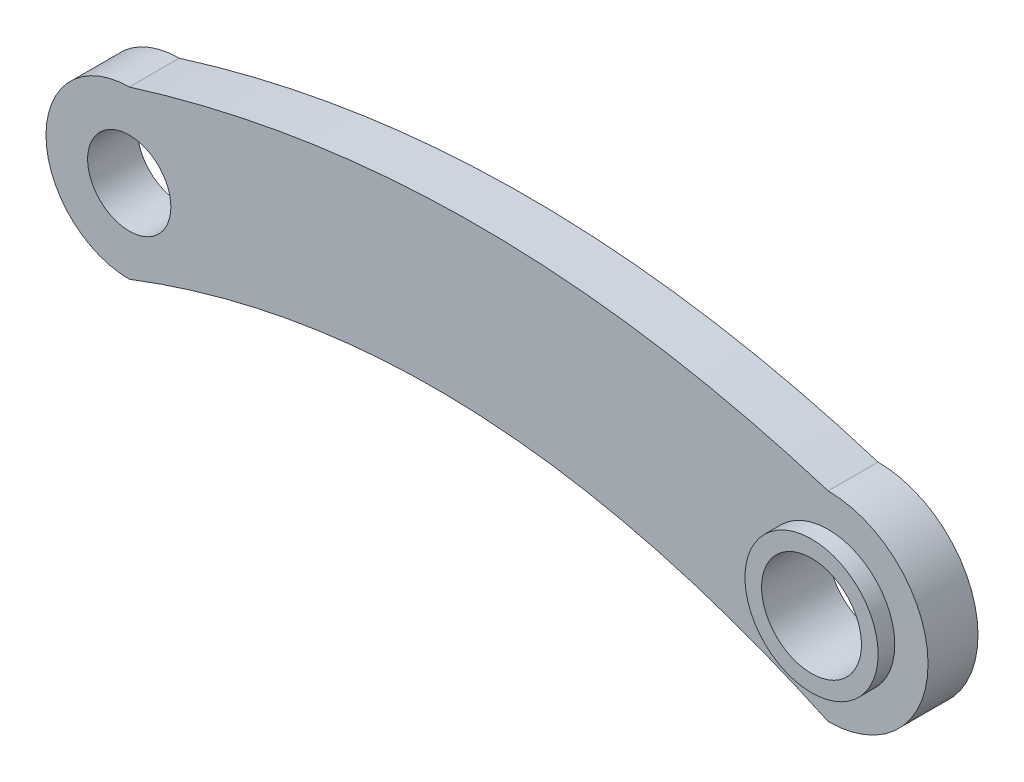
ISO-10303-21;
HEADER;
FILE_DESCRIPTION(('STEP AP214'),'2;1');
FILE_NAME('part.step','',(''),(''),'','','');
FILE_SCHEMA(('AUTOMOTIVE_DESIGN { 1 0 10303 214 1 1 1 1 }'));
ENDSEC;
DATA;
#1=APPLICATION_CONTEXT('core data for automotive mechanical design processes');
#2=APPLICATION_PROTOCOL_DEFINITION('international standard','automotive_design',2000,#1);
#3=PRODUCT_CONTEXT('',#1,'mechanical');
#4=PRODUCT('Part','Part','',(#3));
#5=PRODUCT_RELATED_PRODUCT_CATEGORY('part','',(#4));
#6=PRODUCT_DEFINITION_FORMATION('','',#4);
#7=PRODUCT_DEFINITION_CONTEXT('part definition',#1,'design');
#8=PRODUCT_DEFINITION('design','',#6,#7);
#9=PRODUCT_DEFINITION_SHAPE('','',#8);
#10=(LENGTH_UNIT() NAMED_UNIT(*) SI_UNIT(.MILLI.,.METRE.));
#11=(NAMED_UNIT(*) PLANE_ANGLE_UNIT() SI_UNIT($,.RADIAN.));
#12=(NAMED_UNIT(*) SI_UNIT($,.STERADIAN.) SOLID_ANGLE_UNIT());
#13=UNCERTAINTY_MEASURE_WITH_UNIT(LENGTH_MEASURE(1.E-05),#10,'distance_accuracy_value','');
#14=(GEOMETRIC_REPRESENTATION_CONTEXT(3) GLOBAL_UNCERTAINTY_ASSIGNED_CONTEXT((#13)) GLOBAL_UNIT_ASSIGNED_CONTEXT((#10,
#11,#12)) REPRESENTATION_CONTEXT('',''));
#15=CARTESIAN_POINT('',(0.,0.,0.));
#16=DIRECTION('',(0.,0.,1.));
#17=DIRECTION('',(1.,0.,0.));
#18=AXIS2_PLACEMENT_3D('',#15,#16,#17);
#19=CARTESIAN_POINT('',(-39.0336374567721,318.182293585253,16.7726631352902));
#20=DIRECTION('',(0.,0.,1.));
#21=DIRECTION('',(1.,0.,0.));
#22=AXIS2_PLACEMENT_3D('',#19,#20,#21);
#23=PLANE('',#22);
#24=CARTESIAN_POINT('',(-65.806969864175,351.830304994588,16.7726631352902));
#25=DIRECTION('',(0.,0.,1.));
#26=DIRECTION('',(1.,0.,0.));
#27=AXIS2_PLACEMENT_3D('',#24,#25,#26);
#28=CIRCLE('',#27,5.);
#29=CARTESIAN_POINT('',(-65.806969864175,356.830304994588,16.7726631352902));
#30=VERTEX_POINT('',#29);
#31=CARTESIAN_POINT('',(-65.806969864175,346.830304994588,16.7726631352902));
#32=VERTEX_POINT('',#31);
#33=EDGE_CURVE('E94',#30,#32,#28,.T.);
#34=ORIENTED_EDGE('',*,*,#33,.T.);
#35=CARTESIAN_POINT('',(-65.806969864175,346.830304994588,16.7726631352902));
#36=CARTESIAN_POINT('',(-45.1872674445564,354.758156991937,16.7726631352902));
#37=CARTESIAN_POINT('',(-23.819380034107,344.809373918572,16.7726631352902));
#38=B_SPLINE_CURVE_WITH_KNOTS('',2,(#35,#36,#37),.UNSPECIFIED.,.F.,.F.,(3,3),(0.,1.),.UNSPECIFIED.);
#39=CARTESIAN_POINT('',(-23.819380034107,344.809373918572,16.7726631352902));
#40=VERTEX_POINT('',#39);
#41=EDGE_CURVE('E88',#32,#40,#38,.T.);
#42=ORIENTED_EDGE('',*,*,#41,.T.);
#43=CARTESIAN_POINT('',(-23.819380034107,350.809373918572,16.7726631352902));
#44=DIRECTION('',(0.,0.,1.));
#45=DIRECTION('',(1.,0.,0.));
#46=AXIS2_PLACEMENT_3D('',#43,#44,#45);
#47=CIRCLE('',#46,6.00000000000038);
#48=CARTESIAN_POINT('',(-23.819380034107,356.809373918573,16.7726631352902));
#49=VERTEX_POINT('',#48);
#50=EDGE_CURVE('E91',#49,#40,#47,.F.);
#51=ORIENTED_EDGE('',*,*,#50,.F.);
#52=CARTESIAN_POINT('',(-65.806969864175,356.830304994588,16.7726631352902));
#53=CARTESIAN_POINT('',(-44.8713267346156,363.3688850013,16.7726631352902));
#54=CARTESIAN_POINT('',(-23.819380034107,356.809373918572,16.7726631352902));
#55=B_SPLINE_CURVE_WITH_KNOTS('',2,(#52,#53,#54),.UNSPECIFIED.,.F.,.F.,(3,3),(0.,1.),.UNSPECIFIED.);
#56=EDGE_CURVE('E103',#30,#49,#55,.T.);
#57=ORIENTED_EDGE('',*,*,#56,.F.);
#58=EDGE_LOOP('',(#34,#42,#51,#57));
#59=FACE_BOUND('',#58,.T.);
#60=CARTESIAN_POINT('',(-65.806969864175,351.830304994588,16.7726631352902));
#61=DIRECTION('',(0.,0.,1.));
#62=DIRECTION('',(1.,0.,0.));
#63=AXIS2_PLACEMENT_3D('',#60,#61,#62);
#64=CIRCLE('',#63,2.5);
#65=CARTESIAN_POINT('',(-63.306969864175,351.830304994588,16.7726631352902));
#66=VERTEX_POINT('',#65);
#67=EDGE_CURVE('E170',#66,#66,#64,.T.);
#68=ORIENTED_EDGE('',*,*,#67,.F.);
#69=EDGE_LOOP('',(#68));
#70=FACE_BOUND('',#69,.T.);
#71=CARTESIAN_POINT('',(-23.819380034107,350.809373918572,16.7726631352902));
#72=DIRECTION('',(0.,0.,1.));
#73=DIRECTION('',(1.,0.,0.));
#74=AXIS2_PLACEMENT_3D('',#71,#72,#73);
#75=CIRCLE('',#74,4.);
#76=CARTESIAN_POINT('',(-19.819380034107,350.809373918572,16.7726631352902));
#77=VERTEX_POINT('',#76);
#78=EDGE_CURVE('E159',#77,#77,#75,.T.);
#79=ORIENTED_EDGE('',*,*,#78,.F.);
#80=EDGE_LOOP('',(#79));
#81=FACE_BOUND('',#80,.T.);
#82=ADVANCED_FACE('F42',(#59,#70,#81),#23,.T.);
#83=CARTESIAN_POINT('',(-65.806969864175,351.830304994588,16.7726631352902));
#84=DIRECTION('',(0.,0.,-1.));
#85=DIRECTION('',(-1.,0.,0.));
#86=AXIS2_PLACEMENT_3D('',#83,#84,#85);
#87=CYLINDRICAL_SURFACE('',#86,5.);
#88=CARTESIAN_POINT('',(-65.806969864175,351.830304994588,13.7726631352902));
#89=DIRECTION('',(0.,0.,1.));
#90=DIRECTION('',(1.,0.,0.));
#91=AXIS2_PLACEMENT_3D('',#88,#89,#90);
#92=CIRCLE('',#91,5.);
#93=CARTESIAN_POINT('',(-65.806969864175,356.830304994588,13.7726631352902));
#94=VERTEX_POINT('',#93);
#95=CARTESIAN_POINT('',(-65.806969864175,346.830304994588,13.7726631352902));
#96=VERTEX_POINT('',#95);
#97=EDGE_CURVE('E111',#94,#96,#92,.T.);
#98=ORIENTED_EDGE('',*,*,#97,.T.);
#99=DIRECTION('',(0.,0.,-1.));
#100=VECTOR('',#99,1.);
#101=CARTESIAN_POINT('',(-65.806969864175,346.830304994588,16.7726631352902));
#102=LINE('',#101,#100);
#103=EDGE_CURVE('E12',#32,#96,#102,.T.);
#104=ORIENTED_EDGE('',*,*,#103,.F.);
#105=ORIENTED_EDGE('',*,*,#33,.F.);
#106=DIRECTION('',(0.,0.,-1.));
#107=VECTOR('',#106,1.);
#108=CARTESIAN_POINT('',(-65.806969864175,356.830304994588,16.7726631352902));
#109=LINE('',#108,#107);
#110=EDGE_CURVE('E63',#30,#94,#109,.T.);
#111=ORIENTED_EDGE('',*,*,#110,.T.);
#112=EDGE_LOOP('',(#98,#104,#105,#111));
#113=FACE_BOUND('',#112,.T.);
#114=ADVANCED_FACE('F46',(#113),#87,.T.);
#115=DIRECTION('',(0.,0.,-1.));
#116=VECTOR('',#115,1.);
#117=SURFACE_OF_LINEAR_EXTRUSION('',#38,#116);
#118=CARTESIAN_POINT('',(-65.806969864175,346.830304994588,13.7726631352902));
#119=CARTESIAN_POINT('',(-45.1872674445564,354.758156991937,13.7726631352902));
#120=CARTESIAN_POINT('',(-23.819380034107,344.809373918572,13.7726631352902));
#121=B_SPLINE_CURVE_WITH_KNOTS('',2,(#118,#119,#120),.UNSPECIFIED.,.F.,.F.,(3,3),(0.,1.),.UNSPECIFIED.);
#122=CARTESIAN_POINT('',(-23.819380034107,344.809373918572,13.7726631352902));
#123=VERTEX_POINT('',#122);
#124=EDGE_CURVE('E97',#96,#123,#121,.T.);
#125=ORIENTED_EDGE('',*,*,#124,.T.);
#126=DIRECTION('',(0.,0.,-1.));
#127=VECTOR('',#126,1.);
#128=CARTESIAN_POINT('',(-23.819380034107,344.809373918572,16.7726631352902));
#129=LINE('',#128,#127);
#130=EDGE_CURVE('E52',#40,#123,#129,.T.);
#131=ORIENTED_EDGE('',*,*,#130,.F.);
#132=ORIENTED_EDGE('',*,*,#41,.F.);
#133=ORIENTED_EDGE('',*,*,#103,.T.);
#134=EDGE_LOOP('',(#125,#131,#132,#133));
#135=FACE_BOUND('',#134,.T.);
#136=ADVANCED_FACE('F98',(#135),#117,.F.);
#137=CARTESIAN_POINT('',(-23.819380034107,350.809373918572,16.7726631352902));
#138=DIRECTION('',(0.,0.,-1.));
#139=DIRECTION('',(-1.,0.,0.));
#140=AXIS2_PLACEMENT_3D('',#137,#138,#139);
#141=CYLINDRICAL_SURFACE('',#140,6.00000000000038);
#142=CARTESIAN_POINT('',(-23.819380034107,350.809373918572,13.7726631352902));
#143=DIRECTION('',(0.,0.,1.));
#144=DIRECTION('',(1.,0.,0.));
#145=AXIS2_PLACEMENT_3D('',#142,#143,#144);
#146=CIRCLE('',#145,6.00000000000038);
#147=CARTESIAN_POINT('',(-23.819380034107,356.809373918573,13.7726631352902));
#148=VERTEX_POINT('',#147);
#149=EDGE_CURVE('E178',#148,#123,#146,.F.);
#150=ORIENTED_EDGE('',*,*,#149,.F.);
#151=DIRECTION('',(0.,0.,-1.));
#152=VECTOR('',#151,1.);
#153=CARTESIAN_POINT('',(-23.819380034107,356.809373918573,16.7726631352902));
#154=LINE('',#153,#152);
#155=EDGE_CURVE('E73',#49,#148,#154,.T.);
#156=ORIENTED_EDGE('',*,*,#155,.F.);
#157=ORIENTED_EDGE('',*,*,#50,.T.);
#158=ORIENTED_EDGE('',*,*,#130,.T.);
#159=EDGE_LOOP('',(#150,#156,#157,#158));
#160=FACE_BOUND('',#159,.T.);
#161=ADVANCED_FACE('F105',(#160),#141,.T.);
#162=DIRECTION('',(0.,0.,-1.));
#163=VECTOR('',#162,1.);
#164=SURFACE_OF_LINEAR_EXTRUSION('',#55,#163);
#165=CARTESIAN_POINT('',(-65.806969864175,356.830304994588,13.7726631352902));
#166=CARTESIAN_POINT('',(-44.8713267346156,363.3688850013,13.7726631352902));
#167=CARTESIAN_POINT('',(-23.819380034107,356.809373918572,13.7726631352902));
#168=B_SPLINE_CURVE_WITH_KNOTS('',2,(#165,#166,#167),.UNSPECIFIED.,.F.,.F.,(3,3),(0.,1.),.UNSPECIFIED.);
#169=EDGE_CURVE('E172',#94,#148,#168,.T.);
#170=ORIENTED_EDGE('',*,*,#169,.F.);
#171=ORIENTED_EDGE('',*,*,#110,.F.);
#172=ORIENTED_EDGE('',*,*,#56,.T.);
#173=ORIENTED_EDGE('',*,*,#155,.T.);
#174=EDGE_LOOP('',(#170,#171,#172,#173));
#175=FACE_BOUND('',#174,.T.);
#176=ADVANCED_FACE('F119',(#175),#164,.T.);
#177=CARTESIAN_POINT('',(-39.0336374567721,318.182293585253,13.7726631352902));
#178=DIRECTION('',(0.,0.,1.));
#179=DIRECTION('',(1.,0.,0.));
#180=AXIS2_PLACEMENT_3D('',#177,#178,#179);
#181=PLANE('',#180);
#182=CARTESIAN_POINT('',(-65.806969864175,351.830304994588,13.7726631352902));
#183=DIRECTION('',(0.,0.,1.));
#184=DIRECTION('',(1.,0.,0.));
#185=AXIS2_PLACEMENT_3D('',#182,#183,#184);
#186=CIRCLE('',#185,2.5);
#187=CARTESIAN_POINT('',(-63.306969864175,351.830304994588,13.7726631352902));
#188=VERTEX_POINT('',#187);
#189=EDGE_CURVE('E168',#188,#188,#186,.T.);
#190=ORIENTED_EDGE('',*,*,#189,.T.);
#191=EDGE_LOOP('',(#190));
#192=FACE_BOUND('',#191,.T.);
#193=CARTESIAN_POINT('',(-23.819380034107,350.809373918572,13.7726631352902));
#194=DIRECTION('',(0.,0.,1.));
#195=DIRECTION('',(1.,0.,0.));
#196=AXIS2_PLACEMENT_3D('',#193,#194,#195);
#197=CIRCLE('',#196,3.);
#198=CARTESIAN_POINT('',(-20.819380034107,350.809373918572,13.7726631352902));
#199=VERTEX_POINT('',#198);
#200=EDGE_CURVE('E164',#199,#199,#197,.T.);
#201=ORIENTED_EDGE('',*,*,#200,.T.);
#202=EDGE_LOOP('',(#201));
#203=FACE_BOUND('',#202,.T.);
#204=ORIENTED_EDGE('',*,*,#97,.F.);
#205=ORIENTED_EDGE('',*,*,#169,.T.);
#206=ORIENTED_EDGE('',*,*,#149,.T.);
#207=ORIENTED_EDGE('',*,*,#124,.F.);
#208=EDGE_LOOP('',(#204,#205,#206,#207));
#209=FACE_BOUND('',#208,.T.);
#210=ADVANCED_FACE('F122',(#192,#203,#209),#181,.F.);
#211=CARTESIAN_POINT('',(-23.819380034107,350.809373918572,16.7726631352902));
#212=DIRECTION('',(0.,0.,-1.));
#213=DIRECTION('',(-1.,0.,0.));
#214=AXIS2_PLACEMENT_3D('',#211,#212,#213);
#215=CYLINDRICAL_SURFACE('',#214,3.);
#216=ORIENTED_EDGE('',*,*,#200,.F.);
#217=EDGE_LOOP('',(#216));
#218=FACE_BOUND('',#217,.T.);
#219=CARTESIAN_POINT('',(-23.819380034107,350.809373918572,17.7726631352902));
#220=DIRECTION('',(0.,0.,1.));
#221=DIRECTION('',(1.,0.,0.));
#222=AXIS2_PLACEMENT_3D('',#219,#220,#221);
#223=CIRCLE('',#222,3.);
#224=CARTESIAN_POINT('',(-20.819380034107,350.809373918572,17.7726631352902));
#225=VERTEX_POINT('',#224);
#226=EDGE_CURVE('E158',#225,#225,#223,.T.);
#227=ORIENTED_EDGE('',*,*,#226,.T.);
#228=EDGE_LOOP('',(#227));
#229=FACE_BOUND('',#228,.T.);
#230=ADVANCED_FACE('F134',(#218,#229),#215,.F.);
#231=CARTESIAN_POINT('',(-65.806969864175,351.830304994588,16.7726631352902));
#232=DIRECTION('',(0.,0.,-1.));
#233=DIRECTION('',(-1.,0.,0.));
#234=AXIS2_PLACEMENT_3D('',#231,#232,#233);
#235=CYLINDRICAL_SURFACE('',#234,2.5);
#236=ORIENTED_EDGE('',*,*,#67,.T.);
#237=EDGE_LOOP('',(#236));
#238=FACE_BOUND('',#237,.T.);
#239=ORIENTED_EDGE('',*,*,#189,.F.);
#240=EDGE_LOOP('',(#239));
#241=FACE_BOUND('',#240,.T.);
#242=ADVANCED_FACE('F136',(#238,#241),#235,.F.);
#243=CARTESIAN_POINT('',(-23.819380034107,350.809373918572,17.7726631352902));
#244=DIRECTION('',(0.,0.,1.));
#245=DIRECTION('',(1.,0.,0.));
#246=AXIS2_PLACEMENT_3D('',#243,#244,#245);
#247=PLANE('',#246);
#248=CARTESIAN_POINT('',(-23.819380034107,350.809373918572,17.7726631352902));
#249=DIRECTION('',(0.,0.,1.));
#250=DIRECTION('',(1.,0.,0.));
#251=AXIS2_PLACEMENT_3D('',#248,#249,#250);
#252=CIRCLE('',#251,4.);
#253=CARTESIAN_POINT('',(-19.819380034107,350.809373918572,17.7726631352902));
#254=VERTEX_POINT('',#253);
#255=EDGE_CURVE('E154',#254,#254,#252,.T.);
#256=ORIENTED_EDGE('',*,*,#255,.T.);
#257=EDGE_LOOP('',(#256));
#258=FACE_BOUND('',#257,.T.);
#259=ORIENTED_EDGE('',*,*,#226,.F.);
#260=EDGE_LOOP('',(#259));
#261=FACE_BOUND('',#260,.T.);
#262=ADVANCED_FACE('F142',(#258,#261),#247,.T.);
#263=CARTESIAN_POINT('',(-23.819380034107,350.809373918572,17.7726631352902));
#264=DIRECTION('',(0.,0.,-1.));
#265=DIRECTION('',(-1.,0.,0.));
#266=AXIS2_PLACEMENT_3D('',#263,#264,#265);
#267=CYLINDRICAL_SURFACE('',#266,4.);
#268=ORIENTED_EDGE('',*,*,#255,.F.);
#269=EDGE_LOOP('',(#268));
#270=FACE_BOUND('',#269,.T.);
#271=ORIENTED_EDGE('',*,*,#78,.T.);
#272=EDGE_LOOP('',(#271));
#273=FACE_BOUND('',#272,.T.);
#274=ADVANCED_FACE('F145',(#270,#273),#267,.T.);
#275=CLOSED_SHELL('',(#82,#114,#136,#161,#176,#210,#230,#242,#262,#274));
#276=MANIFOLD_SOLID_BREP('B2',#275);
#277=ADVANCED_BREP_SHAPE_REPRESENTATION('',(#18,#276),#14);
#278=SHAPE_DEFINITION_REPRESENTATION(#9,#277);
ENDSEC;
END-ISO-10303-21;
